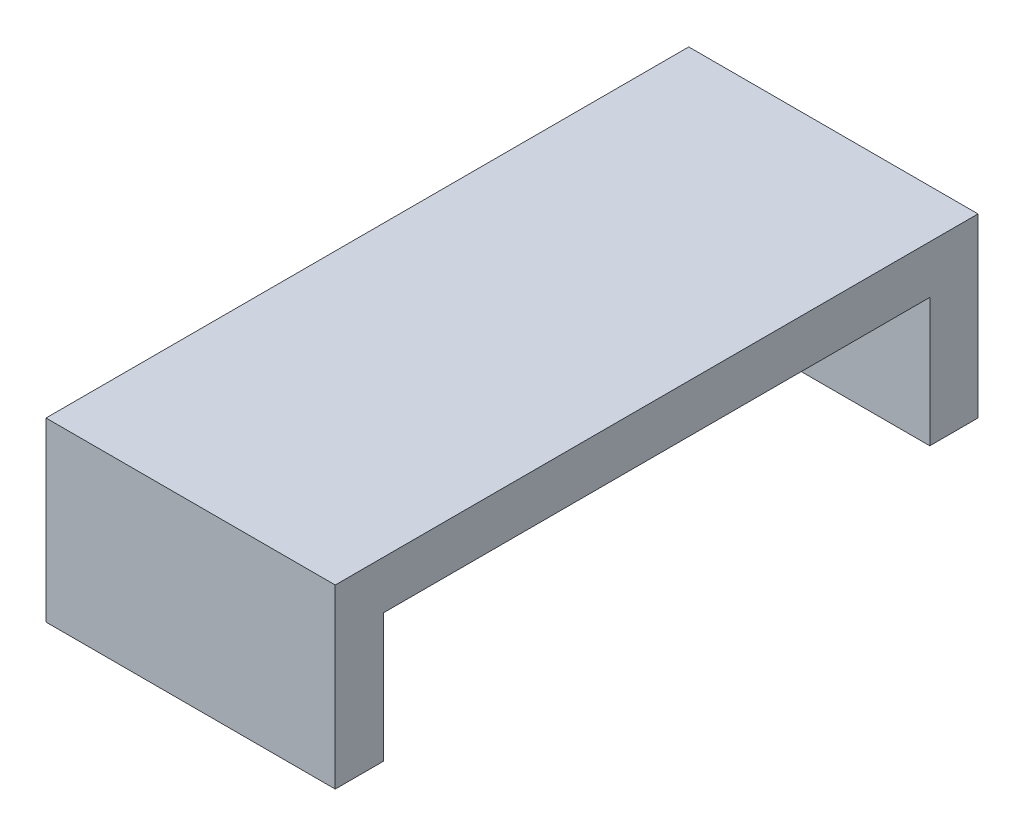
ISO-10303-21;
HEADER;
FILE_DESCRIPTION(('STEP AP214'),'2;1');
FILE_NAME('part.step','',(''),(''),'','','');
FILE_SCHEMA(('AUTOMOTIVE_DESIGN { 1 0 10303 214 1 1 1 1 }'));
ENDSEC;
DATA;
#1=APPLICATION_CONTEXT('core data for automotive mechanical design processes');
#2=APPLICATION_PROTOCOL_DEFINITION('international standard','automotive_design',2000,#1);
#3=PRODUCT_CONTEXT('',#1,'mechanical');
#4=PRODUCT('Part','Part','',(#3));
#5=PRODUCT_RELATED_PRODUCT_CATEGORY('part','',(#4));
#6=PRODUCT_DEFINITION_FORMATION('','',#4);
#7=PRODUCT_DEFINITION_CONTEXT('part definition',#1,'design');
#8=PRODUCT_DEFINITION('design','',#6,#7);
#9=PRODUCT_DEFINITION_SHAPE('','',#8);
#10=(LENGTH_UNIT() NAMED_UNIT(*) SI_UNIT(.MILLI.,.METRE.));
#11=(NAMED_UNIT(*) PLANE_ANGLE_UNIT() SI_UNIT($,.RADIAN.));
#12=(NAMED_UNIT(*) SI_UNIT($,.STERADIAN.) SOLID_ANGLE_UNIT());
#13=UNCERTAINTY_MEASURE_WITH_UNIT(LENGTH_MEASURE(1.E-05),#10,'distance_accuracy_value','');
#14=(GEOMETRIC_REPRESENTATION_CONTEXT(3) GLOBAL_UNCERTAINTY_ASSIGNED_CONTEXT((#13)) GLOBAL_UNIT_ASSIGNED_CONTEXT((#10,
#11,#12)) REPRESENTATION_CONTEXT('',''));
#15=CARTESIAN_POINT('',(0.,0.,0.));
#16=DIRECTION('',(0.,0.,1.));
#17=DIRECTION('',(1.,0.,0.));
#18=AXIS2_PLACEMENT_3D('',#15,#16,#17);
#19=CARTESIAN_POINT('',(150.,0.,370.));
#20=DIRECTION('',(0.,0.,-1.));
#21=DIRECTION('',(-1.,0.,0.));
#22=AXIS2_PLACEMENT_3D('',#19,#20,#21);
#23=PLANE('',#22);
#24=DIRECTION('',(-1.,0.,0.));
#25=VECTOR('',#24,1.);
#26=CARTESIAN_POINT('',(150.,110.,370.));
#27=LINE('',#26,#25);
#28=CARTESIAN_POINT('',(150.,110.,370.));
#29=VERTEX_POINT('',#28);
#30=CARTESIAN_POINT('',(-30.,110.,370.));
#31=VERTEX_POINT('',#30);
#32=EDGE_CURVE('E150',#29,#31,#27,.T.);
#33=ORIENTED_EDGE('',*,*,#32,.T.);
#34=DIRECTION('',(0.,1.,0.));
#35=VECTOR('',#34,1.);
#36=CARTESIAN_POINT('',(-30.,0.,370.));
#37=LINE('',#36,#35);
#38=CARTESIAN_POINT('',(-30.,0.,370.));
#39=VERTEX_POINT('',#38);
#40=EDGE_CURVE('E118',#39,#31,#37,.T.);
#41=ORIENTED_EDGE('',*,*,#40,.F.);
#42=DIRECTION('',(-1.,0.,0.));
#43=VECTOR('',#42,1.);
#44=CARTESIAN_POINT('',(150.,0.,370.));
#45=LINE('',#44,#43);
#46=CARTESIAN_POINT('',(150.,0.,370.));
#47=VERTEX_POINT('',#46);
#48=EDGE_CURVE('E11',#47,#39,#45,.T.);
#49=ORIENTED_EDGE('',*,*,#48,.F.);
#50=DIRECTION('',(0.,-1.,0.));
#51=VECTOR('',#50,1.);
#52=CARTESIAN_POINT('',(150.,0.,370.));
#53=LINE('',#52,#51);
#54=EDGE_CURVE('E134',#29,#47,#53,.T.);
#55=ORIENTED_EDGE('',*,*,#54,.F.);
#56=EDGE_LOOP('',(#33,#41,#49,#55));
#57=FACE_BOUND('',#56,.T.);
#58=ADVANCED_FACE('F35',(#57),#23,.F.);
#59=CARTESIAN_POINT('',(150.,0.,340.));
#60=DIRECTION('',(0.,0.,1.));
#61=DIRECTION('',(1.,0.,0.));
#62=AXIS2_PLACEMENT_3D('',#59,#60,#61);
#63=PLANE('',#62);
#64=DIRECTION('',(0.,1.,0.));
#65=VECTOR('',#64,1.);
#66=CARTESIAN_POINT('',(0.,0.,340.));
#67=LINE('',#66,#65);
#68=CARTESIAN_POINT('',(0.,0.,340.));
#69=VERTEX_POINT('',#68);
#70=CARTESIAN_POINT('',(0.,80.,340.));
#71=VERTEX_POINT('',#70);
#72=EDGE_CURVE('E131',#69,#71,#67,.T.);
#73=ORIENTED_EDGE('',*,*,#72,.T.);
#74=DIRECTION('',(-1.,0.,0.));
#75=VECTOR('',#74,1.);
#76=CARTESIAN_POINT('',(150.,80.,340.));
#77=LINE('',#76,#75);
#78=CARTESIAN_POINT('',(150.,80.,340.));
#79=VERTEX_POINT('',#78);
#80=EDGE_CURVE('E160',#79,#71,#77,.T.);
#81=ORIENTED_EDGE('',*,*,#80,.F.);
#82=DIRECTION('',(0.,1.,0.));
#83=VECTOR('',#82,1.);
#84=CARTESIAN_POINT('',(150.,0.,340.));
#85=LINE('',#84,#83);
#86=CARTESIAN_POINT('',(150.,0.,340.));
#87=VERTEX_POINT('',#86);
#88=EDGE_CURVE('E138',#87,#79,#85,.T.);
#89=ORIENTED_EDGE('',*,*,#88,.F.);
#90=DIRECTION('',(-1.,0.,0.));
#91=VECTOR('',#90,1.);
#92=CARTESIAN_POINT('',(150.,0.,340.));
#93=LINE('',#92,#91);
#94=EDGE_CURVE('E45',#87,#69,#93,.T.);
#95=ORIENTED_EDGE('',*,*,#94,.T.);
#96=EDGE_LOOP('',(#73,#81,#89,#95));
#97=FACE_BOUND('',#96,.T.);
#98=ADVANCED_FACE('F182',(#97),#63,.F.);
#99=CARTESIAN_POINT('',(150.,80.,0.));
#100=DIRECTION('',(0.,-1.,0.));
#101=DIRECTION('',(0.,0.,-1.));
#102=AXIS2_PLACEMENT_3D('',#99,#100,#101);
#103=PLANE('',#102);
#104=DIRECTION('',(0.,0.,1.));
#105=VECTOR('',#104,1.);
#106=CARTESIAN_POINT('',(0.,80.,0.));
#107=LINE('',#106,#105);
#108=CARTESIAN_POINT('',(0.,80.,0.));
#109=VERTEX_POINT('',#108);
#110=EDGE_CURVE('E151',#109,#71,#107,.T.);
#111=ORIENTED_EDGE('',*,*,#110,.F.);
#112=DIRECTION('',(-1.,0.,0.));
#113=VECTOR('',#112,1.);
#114=CARTESIAN_POINT('',(150.,80.,0.));
#115=LINE('',#114,#113);
#116=CARTESIAN_POINT('',(150.,80.,0.));
#117=VERTEX_POINT('',#116);
#118=EDGE_CURVE('E157',#117,#109,#115,.T.);
#119=ORIENTED_EDGE('',*,*,#118,.F.);
#120=DIRECTION('',(0.,0.,1.));
#121=VECTOR('',#120,1.);
#122=CARTESIAN_POINT('',(150.,80.,0.));
#123=LINE('',#122,#121);
#124=EDGE_CURVE('E140',#117,#79,#123,.T.);
#125=ORIENTED_EDGE('',*,*,#124,.T.);
#126=ORIENTED_EDGE('',*,*,#80,.T.);
#127=EDGE_LOOP('',(#111,#119,#125,#126));
#128=FACE_BOUND('',#127,.T.);
#129=ADVANCED_FACE('F201',(#128),#103,.T.);
#130=CARTESIAN_POINT('',(150.,0.,0.));
#131=DIRECTION('',(0.,0.,1.));
#132=DIRECTION('',(1.,0.,0.));
#133=AXIS2_PLACEMENT_3D('',#130,#131,#132);
#134=PLANE('',#133);
#135=DIRECTION('',(0.,1.,0.));
#136=VECTOR('',#135,1.);
#137=CARTESIAN_POINT('',(0.,0.,0.));
#138=LINE('',#137,#136);
#139=CARTESIAN_POINT('',(0.,0.,0.));
#140=VERTEX_POINT('',#139);
#141=EDGE_CURVE('E38',#140,#109,#138,.T.);
#142=ORIENTED_EDGE('',*,*,#141,.F.);
#143=DIRECTION('',(-1.,0.,0.));
#144=VECTOR('',#143,1.);
#145=CARTESIAN_POINT('',(150.,0.,0.));
#146=LINE('',#145,#144);
#147=CARTESIAN_POINT('',(150.,0.,0.));
#148=VERTEX_POINT('',#147);
#149=EDGE_CURVE('E107',#148,#140,#146,.T.);
#150=ORIENTED_EDGE('',*,*,#149,.F.);
#151=DIRECTION('',(0.,1.,0.));
#152=VECTOR('',#151,1.);
#153=CARTESIAN_POINT('',(150.,0.,0.));
#154=LINE('',#153,#152);
#155=EDGE_CURVE('E143',#148,#117,#154,.T.);
#156=ORIENTED_EDGE('',*,*,#155,.T.);
#157=ORIENTED_EDGE('',*,*,#118,.T.);
#158=EDGE_LOOP('',(#142,#150,#156,#157));
#159=FACE_BOUND('',#158,.T.);
#160=ADVANCED_FACE('F176',(#159),#134,.T.);
#161=CARTESIAN_POINT('',(150.,0.,0.));
#162=DIRECTION('',(0.,1.,0.));
#163=DIRECTION('',(0.,0.,1.));
#164=AXIS2_PLACEMENT_3D('',#161,#162,#163);
#165=PLANE('',#164);
#166=ORIENTED_EDGE('',*,*,#149,.T.);
#167=DIRECTION('',(0.,0.,1.));
#168=VECTOR('',#167,1.);
#169=CARTESIAN_POINT('',(0.,0.,-30.));
#170=LINE('',#169,#168);
#171=EDGE_CURVE('E124',#140,#69,#170,.T.);
#172=ORIENTED_EDGE('',*,*,#171,.T.);
#173=ORIENTED_EDGE('',*,*,#94,.F.);
#174=DIRECTION('',(0.,0.,-1.));
#175=VECTOR('',#174,1.);
#176=CARTESIAN_POINT('',(150.,0.,0.));
#177=LINE('',#176,#175);
#178=EDGE_CURVE('E136',#47,#87,#177,.T.);
#179=ORIENTED_EDGE('',*,*,#178,.F.);
#180=ORIENTED_EDGE('',*,*,#48,.T.);
#181=DIRECTION('',(0.,0.,1.));
#182=VECTOR('',#181,1.);
#183=CARTESIAN_POINT('',(-30.,0.,-30.));
#184=LINE('',#183,#182);
#185=CARTESIAN_POINT('',(-30.,0.,-30.));
#186=VERTEX_POINT('',#185);
#187=EDGE_CURVE('E111',#186,#39,#184,.T.);
#188=ORIENTED_EDGE('',*,*,#187,.F.);
#189=DIRECTION('',(-1.,0.,0.));
#190=VECTOR('',#189,1.);
#191=CARTESIAN_POINT('',(150.,0.,-30.));
#192=LINE('',#191,#190);
#193=CARTESIAN_POINT('',(150.,0.,-30.));
#194=VERTEX_POINT('',#193);
#195=EDGE_CURVE('E98',#194,#186,#192,.T.);
#196=ORIENTED_EDGE('',*,*,#195,.F.);
#197=DIRECTION('',(0.,0.,-1.));
#198=VECTOR('',#197,1.);
#199=CARTESIAN_POINT('',(150.,0.,0.));
#200=LINE('',#199,#198);
#201=EDGE_CURVE('E146',#148,#194,#200,.T.);
#202=ORIENTED_EDGE('',*,*,#201,.F.);
#203=EDGE_LOOP('',(#166,#172,#173,#179,#180,#188,#196,#202));
#204=FACE_BOUND('',#203,.T.);
#205=ADVANCED_FACE('F113',(#204),#165,.F.);
#206=CARTESIAN_POINT('',(150.,0.,-30.));
#207=DIRECTION('',(0.,0.,1.));
#208=DIRECTION('',(1.,0.,0.));
#209=AXIS2_PLACEMENT_3D('',#206,#207,#208);
#210=PLANE('',#209);
#211=ORIENTED_EDGE('',*,*,#195,.T.);
#212=DIRECTION('',(0.,-1.,0.));
#213=VECTOR('',#212,1.);
#214=CARTESIAN_POINT('',(-30.,0.,-30.));
#215=LINE('',#214,#213);
#216=CARTESIAN_POINT('',(-30.,110.,-30.));
#217=VERTEX_POINT('',#216);
#218=EDGE_CURVE('E103',#217,#186,#215,.T.);
#219=ORIENTED_EDGE('',*,*,#218,.F.);
#220=DIRECTION('',(-1.,0.,0.));
#221=VECTOR('',#220,1.);
#222=CARTESIAN_POINT('',(150.,110.,-30.));
#223=LINE('',#222,#221);
#224=CARTESIAN_POINT('',(150.,110.,-30.));
#225=VERTEX_POINT('',#224);
#226=EDGE_CURVE('E108',#225,#217,#223,.T.);
#227=ORIENTED_EDGE('',*,*,#226,.F.);
#228=DIRECTION('',(0.,1.,0.));
#229=VECTOR('',#228,1.);
#230=CARTESIAN_POINT('',(150.,0.,-30.));
#231=LINE('',#230,#229);
#232=EDGE_CURVE('E104',#194,#225,#231,.T.);
#233=ORIENTED_EDGE('',*,*,#232,.F.);
#234=EDGE_LOOP('',(#211,#219,#227,#233));
#235=FACE_BOUND('',#234,.T.);
#236=ADVANCED_FACE('F100',(#235),#210,.F.);
#237=CARTESIAN_POINT('',(150.,110.,0.));
#238=DIRECTION('',(0.,-1.,0.));
#239=DIRECTION('',(0.,0.,-1.));
#240=AXIS2_PLACEMENT_3D('',#237,#238,#239);
#241=PLANE('',#240);
#242=ORIENTED_EDGE('',*,*,#226,.T.);
#243=DIRECTION('',(0.,0.,-1.));
#244=VECTOR('',#243,1.);
#245=CARTESIAN_POINT('',(-30.,110.,-30.));
#246=LINE('',#245,#244);
#247=EDGE_CURVE('E123',#31,#217,#246,.T.);
#248=ORIENTED_EDGE('',*,*,#247,.F.);
#249=ORIENTED_EDGE('',*,*,#32,.F.);
#250=DIRECTION('',(0.,0.,1.));
#251=VECTOR('',#250,1.);
#252=CARTESIAN_POINT('',(150.,110.,0.));
#253=LINE('',#252,#251);
#254=EDGE_CURVE('E53',#225,#29,#253,.T.);
#255=ORIENTED_EDGE('',*,*,#254,.F.);
#256=EDGE_LOOP('',(#242,#248,#249,#255));
#257=FACE_BOUND('',#256,.T.);
#258=ADVANCED_FACE('F188',(#257),#241,.F.);
#259=CARTESIAN_POINT('',(150.,0.,0.));
#260=DIRECTION('',(1.,0.,0.));
#261=DIRECTION('',(0.,0.,-1.));
#262=AXIS2_PLACEMENT_3D('',#259,#260,#261);
#263=PLANE('',#262);
#264=ORIENTED_EDGE('',*,*,#54,.T.);
#265=ORIENTED_EDGE('',*,*,#178,.T.);
#266=ORIENTED_EDGE('',*,*,#88,.T.);
#267=ORIENTED_EDGE('',*,*,#124,.F.);
#268=ORIENTED_EDGE('',*,*,#155,.F.);
#269=ORIENTED_EDGE('',*,*,#201,.T.);
#270=ORIENTED_EDGE('',*,*,#232,.T.);
#271=ORIENTED_EDGE('',*,*,#254,.T.);
#272=EDGE_LOOP('',(#264,#265,#266,#267,#268,#269,#270,#271));
#273=FACE_BOUND('',#272,.T.);
#274=ADVANCED_FACE('F185',(#273),#263,.T.);
#275=CARTESIAN_POINT('',(-30.,0.,0.));
#276=DIRECTION('',(1.,0.,0.));
#277=DIRECTION('',(0.,0.,-1.));
#278=AXIS2_PLACEMENT_3D('',#275,#276,#277);
#279=PLANE('',#278);
#280=ORIENTED_EDGE('',*,*,#218,.T.);
#281=ORIENTED_EDGE('',*,*,#187,.T.);
#282=ORIENTED_EDGE('',*,*,#40,.T.);
#283=ORIENTED_EDGE('',*,*,#247,.T.);
#284=EDGE_LOOP('',(#280,#281,#282,#283));
#285=FACE_BOUND('',#284,.T.);
#286=ADVANCED_FACE('F121',(#285),#279,.F.);
#287=CARTESIAN_POINT('',(0.,0.,0.));
#288=DIRECTION('',(1.,0.,0.));
#289=DIRECTION('',(0.,0.,-1.));
#290=AXIS2_PLACEMENT_3D('',#287,#288,#289);
#291=PLANE('',#290);
#292=ORIENTED_EDGE('',*,*,#171,.F.);
#293=ORIENTED_EDGE('',*,*,#141,.T.);
#294=ORIENTED_EDGE('',*,*,#110,.T.);
#295=ORIENTED_EDGE('',*,*,#72,.F.);
#296=EDGE_LOOP('',(#292,#293,#294,#295));
#297=FACE_BOUND('',#296,.T.);
#298=ADVANCED_FACE('F179',(#297),#291,.T.);
#299=CLOSED_SHELL('',(#58,#98,#129,#160,#205,#236,#258,#274,#286,#298));
#300=MANIFOLD_SOLID_BREP('B2',#299);
#301=ADVANCED_BREP_SHAPE_REPRESENTATION('',(#18,#300),#14);
#302=SHAPE_DEFINITION_REPRESENTATION(#9,#301);
ENDSEC;
END-ISO-10303-21;
